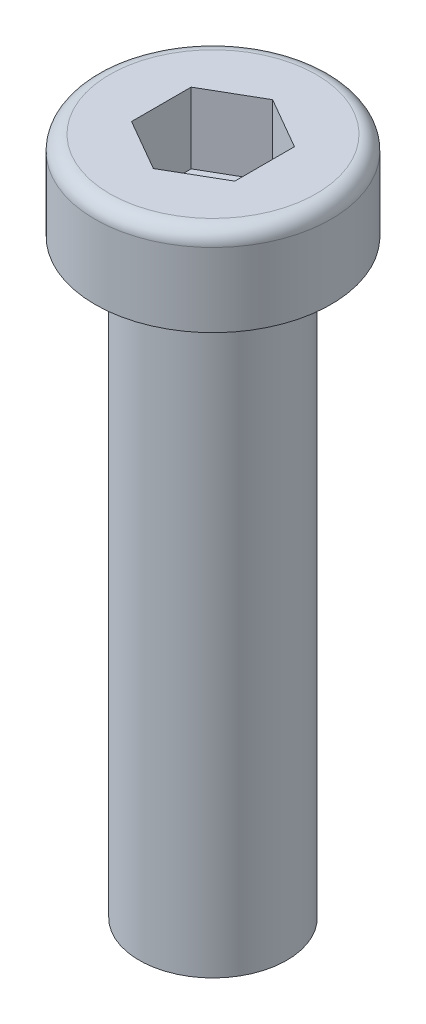
ISO-10303-21;
HEADER;
FILE_DESCRIPTION(('STEP AP214'),'2;1');
FILE_NAME('part.step','',(''),(''),'','','');
FILE_SCHEMA(('AUTOMOTIVE_DESIGN { 1 0 10303 214 1 1 1 1 }'));
ENDSEC;
DATA;
#1=APPLICATION_CONTEXT('core data for automotive mechanical design processes');
#2=APPLICATION_PROTOCOL_DEFINITION('international standard','automotive_design',2000,#1);
#3=PRODUCT_CONTEXT('',#1,'mechanical');
#4=PRODUCT('Part','Part','',(#3));
#5=PRODUCT_RELATED_PRODUCT_CATEGORY('part','',(#4));
#6=PRODUCT_DEFINITION_FORMATION('','',#4);
#7=PRODUCT_DEFINITION_CONTEXT('part definition',#1,'design');
#8=PRODUCT_DEFINITION('design','',#6,#7);
#9=PRODUCT_DEFINITION_SHAPE('','',#8);
#10=(LENGTH_UNIT() NAMED_UNIT(*) SI_UNIT(.MILLI.,.METRE.));
#11=(NAMED_UNIT(*) PLANE_ANGLE_UNIT() SI_UNIT($,.RADIAN.));
#12=(NAMED_UNIT(*) SI_UNIT($,.STERADIAN.) SOLID_ANGLE_UNIT());
#13=UNCERTAINTY_MEASURE_WITH_UNIT(LENGTH_MEASURE(1.E-05),#10,'distance_accuracy_value','');
#14=(GEOMETRIC_REPRESENTATION_CONTEXT(3) GLOBAL_UNCERTAINTY_ASSIGNED_CONTEXT((#13)) GLOBAL_UNIT_ASSIGNED_CONTEXT((#10,
#11,#12)) REPRESENTATION_CONTEXT('',''));
#15=CARTESIAN_POINT('',(0.,0.,0.));
#16=DIRECTION('',(0.,0.,1.));
#17=DIRECTION('',(1.,0.,0.));
#18=AXIS2_PLACEMENT_3D('',#15,#16,#17);
#19=CARTESIAN_POINT('',(0.,46.,0.));
#20=DIRECTION('',(0.,-1.,0.));
#21=DIRECTION('',(0.,0.,-1.));
#22=AXIS2_PLACEMENT_3D('',#19,#20,#21);
#23=PLANE('',#22);
#24=DIRECTION('',(-0.866025403784439,0.,0.5));
#25=VECTOR('',#24,1.);
#26=CARTESIAN_POINT('',(0.,46.,-4.04145188432738));
#27=LINE('',#26,#25);
#28=CARTESIAN_POINT('',(0.,46.,-4.04145188432738));
#29=VERTEX_POINT('',#28);
#30=CARTESIAN_POINT('',(-3.5,46.,-2.02072594216369));
#31=VERTEX_POINT('',#30);
#32=EDGE_CURVE('E125',#29,#31,#27,.T.);
#33=ORIENTED_EDGE('',*,*,#32,.F.);
#34=DIRECTION('',(-0.866025403784439,0.,-0.5));
#35=VECTOR('',#34,1.);
#36=CARTESIAN_POINT('',(3.5,46.,-2.02072594216369));
#37=LINE('',#36,#35);
#38=CARTESIAN_POINT('',(3.5,46.,-2.02072594216369));
#39=VERTEX_POINT('',#38);
#40=EDGE_CURVE('E51',#39,#29,#37,.T.);
#41=ORIENTED_EDGE('',*,*,#40,.F.);
#42=DIRECTION('',(0.,0.,-1.));
#43=VECTOR('',#42,1.);
#44=CARTESIAN_POINT('',(3.50000000000001,46.,2.02072594216369));
#45=LINE('',#44,#43);
#46=CARTESIAN_POINT('',(3.50000000000001,46.,2.02072594216369));
#47=VERTEX_POINT('',#46);
#48=EDGE_CURVE('E134',#47,#39,#45,.T.);
#49=ORIENTED_EDGE('',*,*,#48,.F.);
#50=DIRECTION('',(0.866025403784439,0.,-0.5));
#51=VECTOR('',#50,1.);
#52=CARTESIAN_POINT('',(0.,46.,4.04145188432738));
#53=LINE('',#52,#51);
#54=CARTESIAN_POINT('',(0.,46.,4.04145188432738));
#55=VERTEX_POINT('',#54);
#56=EDGE_CURVE('E132',#55,#47,#53,.T.);
#57=ORIENTED_EDGE('',*,*,#56,.F.);
#58=DIRECTION('',(0.866025403784439,0.,0.5));
#59=VECTOR('',#58,1.);
#60=CARTESIAN_POINT('',(-3.5,46.,2.02072594216369));
#61=LINE('',#60,#59);
#62=CARTESIAN_POINT('',(-3.5,46.,2.02072594216369));
#63=VERTEX_POINT('',#62);
#64=EDGE_CURVE('E99',#63,#55,#61,.T.);
#65=ORIENTED_EDGE('',*,*,#64,.F.);
#66=DIRECTION('',(0.,0.,1.));
#67=VECTOR('',#66,1.);
#68=CARTESIAN_POINT('',(-3.5,46.,-2.02072594216369));
#69=LINE('',#68,#67);
#70=EDGE_CURVE('E128',#31,#63,#69,.T.);
#71=ORIENTED_EDGE('',*,*,#70,.F.);
#72=EDGE_LOOP('',(#33,#41,#49,#57,#65,#71));
#73=FACE_BOUND('',#72,.T.);
#74=CARTESIAN_POINT('',(0.,46.,0.));
#75=DIRECTION('',(0.,-1.,0.));
#76=DIRECTION('',(0.,0.,-1.));
#77=AXIS2_PLACEMENT_3D('',#74,#75,#76);
#78=CIRCLE('',#77,7.);
#79=CARTESIAN_POINT('',(0.,46.,-7.));
#80=VERTEX_POINT('',#79);
#81=EDGE_CURVE('E11',#80,#80,#78,.T.);
#82=ORIENTED_EDGE('',*,*,#81,.F.);
#83=EDGE_LOOP('',(#82));
#84=FACE_BOUND('',#83,.T.);
#85=ADVANCED_FACE('F37',(#73,#84),#23,.F.);
#86=CARTESIAN_POINT('',(0.,45.,0.));
#87=DIRECTION('',(0.,-1.,0.));
#88=DIRECTION('',(0.,0.,-1.));
#89=AXIS2_PLACEMENT_3D('',#86,#87,#88);
#90=TOROIDAL_SURFACE('',#89,7.,1.);
#91=CARTESIAN_POINT('',(0.,45.,0.));
#92=DIRECTION('',(0.,-1.,0.));
#93=DIRECTION('',(0.,0.,-1.));
#94=AXIS2_PLACEMENT_3D('',#91,#92,#93);
#95=CIRCLE('',#94,8.);
#96=CARTESIAN_POINT('',(0.,45.,-8.));
#97=VERTEX_POINT('',#96);
#98=EDGE_CURVE('E44',#97,#97,#95,.T.);
#99=ORIENTED_EDGE('',*,*,#98,.F.);
#100=EDGE_LOOP('',(#99));
#101=FACE_BOUND('',#100,.T.);
#102=ORIENTED_EDGE('',*,*,#81,.T.);
#103=EDGE_LOOP('',(#102));
#104=FACE_BOUND('',#103,.T.);
#105=ADVANCED_FACE('F156',(#101,#104),#90,.T.);
#106=CARTESIAN_POINT('',(0.,0.,0.));
#107=DIRECTION('',(0.,-1.,0.));
#108=DIRECTION('',(0.,0.,-1.));
#109=AXIS2_PLACEMENT_3D('',#106,#107,#108);
#110=CYLINDRICAL_SURFACE('',#109,8.);
#111=CARTESIAN_POINT('',(0.,40.,0.));
#112=DIRECTION('',(0.,-1.,0.));
#113=DIRECTION('',(0.,0.,-1.));
#114=AXIS2_PLACEMENT_3D('',#111,#112,#113);
#115=CIRCLE('',#114,8.);
#116=CARTESIAN_POINT('',(0.,40.,-8.));
#117=VERTEX_POINT('',#116);
#118=EDGE_CURVE('E149',#117,#117,#115,.T.);
#119=ORIENTED_EDGE('',*,*,#118,.F.);
#120=EDGE_LOOP('',(#119));
#121=FACE_BOUND('',#120,.T.);
#122=ORIENTED_EDGE('',*,*,#98,.T.);
#123=EDGE_LOOP('',(#122));
#124=FACE_BOUND('',#123,.T.);
#125=ADVANCED_FACE('F154',(#121,#124),#110,.T.);
#126=CARTESIAN_POINT('',(-8.,40.,0.));
#127=DIRECTION('',(0.,1.,0.));
#128=DIRECTION('',(0.,0.,1.));
#129=AXIS2_PLACEMENT_3D('',#126,#127,#128);
#130=PLANE('',#129);
#131=CARTESIAN_POINT('',(0.,40.,0.));
#132=DIRECTION('',(0.,-1.,0.));
#133=DIRECTION('',(0.,0.,-1.));
#134=AXIS2_PLACEMENT_3D('',#131,#132,#133);
#135=CIRCLE('',#134,5.);
#136=CARTESIAN_POINT('',(0.,40.,-5.));
#137=VERTEX_POINT('',#136);
#138=EDGE_CURVE('E146',#137,#137,#135,.T.);
#139=ORIENTED_EDGE('',*,*,#138,.F.);
#140=EDGE_LOOP('',(#139));
#141=FACE_BOUND('',#140,.T.);
#142=ORIENTED_EDGE('',*,*,#118,.T.);
#143=EDGE_LOOP('',(#142));
#144=FACE_BOUND('',#143,.T.);
#145=ADVANCED_FACE('F189',(#141,#144),#130,.F.);
#146=CARTESIAN_POINT('',(0.,0.,0.));
#147=DIRECTION('',(0.,-1.,0.));
#148=DIRECTION('',(0.,0.,-1.));
#149=AXIS2_PLACEMENT_3D('',#146,#147,#148);
#150=CYLINDRICAL_SURFACE('',#149,5.);
#151=CARTESIAN_POINT('',(0.,0.,0.));
#152=DIRECTION('',(0.,-1.,0.));
#153=DIRECTION('',(0.,0.,-1.));
#154=AXIS2_PLACEMENT_3D('',#151,#152,#153);
#155=CIRCLE('',#154,5.);
#156=CARTESIAN_POINT('',(0.,0.,-5.));
#157=VERTEX_POINT('',#156);
#158=EDGE_CURVE('E138',#157,#157,#155,.T.);
#159=ORIENTED_EDGE('',*,*,#158,.F.);
#160=EDGE_LOOP('',(#159));
#161=FACE_BOUND('',#160,.T.);
#162=ORIENTED_EDGE('',*,*,#138,.T.);
#163=EDGE_LOOP('',(#162));
#164=FACE_BOUND('',#163,.T.);
#165=ADVANCED_FACE('F181',(#161,#164),#150,.T.);
#166=CARTESIAN_POINT('',(-5.,0.,0.));
#167=DIRECTION('',(0.,1.,0.));
#168=DIRECTION('',(0.,0.,1.));
#169=AXIS2_PLACEMENT_3D('',#166,#167,#168);
#170=PLANE('',#169);
#171=ORIENTED_EDGE('',*,*,#158,.T.);
#172=EDGE_LOOP('',(#171));
#173=FACE_BOUND('',#172,.T.);
#174=ADVANCED_FACE('F175',(#173),#170,.F.);
#175=CARTESIAN_POINT('',(3.5,41.2,-2.02072594216369));
#176=DIRECTION('',(0.5,0.,-0.866025403784439));
#177=DIRECTION('',(-0.866025403784439,0.,-0.5));
#178=AXIS2_PLACEMENT_3D('',#175,#176,#177);
#179=PLANE('',#178);
#180=ORIENTED_EDGE('',*,*,#40,.T.);
#181=DIRECTION('',(0.,1.,0.));
#182=VECTOR('',#181,1.);
#183=CARTESIAN_POINT('',(0.,41.2,-4.04145188432738));
#184=LINE('',#183,#182);
#185=CARTESIAN_POINT('',(0.,41.2,-4.04145188432738));
#186=VERTEX_POINT('',#185);
#187=EDGE_CURVE('E81',#186,#29,#184,.T.);
#188=ORIENTED_EDGE('',*,*,#187,.F.);
#189=DIRECTION('',(-0.866025403784439,0.,-0.5));
#190=VECTOR('',#189,1.);
#191=CARTESIAN_POINT('',(3.5,41.2,-2.02072594216369));
#192=LINE('',#191,#190);
#193=CARTESIAN_POINT('',(3.5,41.2,-2.02072594216369));
#194=VERTEX_POINT('',#193);
#195=EDGE_CURVE('E136',#194,#186,#192,.T.);
#196=ORIENTED_EDGE('',*,*,#195,.F.);
#197=DIRECTION('',(0.,1.,0.));
#198=VECTOR('',#197,1.);
#199=CARTESIAN_POINT('',(3.5,41.2,-2.02072594216369));
#200=LINE('',#199,#198);
#201=EDGE_CURVE('E59',#194,#39,#200,.T.);
#202=ORIENTED_EDGE('',*,*,#201,.T.);
#203=EDGE_LOOP('',(#180,#188,#196,#202));
#204=FACE_BOUND('',#203,.T.);
#205=ADVANCED_FACE('F173',(#204),#179,.F.);
#206=CARTESIAN_POINT('',(3.50000000000001,41.2,2.02072594216369));
#207=DIRECTION('',(1.,0.,0.));
#208=DIRECTION('',(0.,0.,-1.));
#209=AXIS2_PLACEMENT_3D('',#206,#207,#208);
#210=PLANE('',#209);
#211=ORIENTED_EDGE('',*,*,#48,.T.);
#212=ORIENTED_EDGE('',*,*,#201,.F.);
#213=DIRECTION('',(0.,0.,-1.));
#214=VECTOR('',#213,1.);
#215=CARTESIAN_POINT('',(3.50000000000001,41.2,2.02072594216369));
#216=LINE('',#215,#214);
#217=CARTESIAN_POINT('',(3.50000000000001,41.2,2.02072594216369));
#218=VERTEX_POINT('',#217);
#219=EDGE_CURVE('E111',#218,#194,#216,.T.);
#220=ORIENTED_EDGE('',*,*,#219,.F.);
#221=DIRECTION('',(0.,1.,0.));
#222=VECTOR('',#221,1.);
#223=CARTESIAN_POINT('',(3.50000000000001,41.2,2.02072594216369));
#224=LINE('',#223,#222);
#225=EDGE_CURVE('E103',#218,#47,#224,.T.);
#226=ORIENTED_EDGE('',*,*,#225,.T.);
#227=EDGE_LOOP('',(#211,#212,#220,#226));
#228=FACE_BOUND('',#227,.T.);
#229=ADVANCED_FACE('F174',(#228),#210,.F.);
#230=CARTESIAN_POINT('',(0.,41.2,4.04145188432738));
#231=DIRECTION('',(0.5,0.,0.866025403784439));
#232=DIRECTION('',(0.866025403784439,0.,-0.5));
#233=AXIS2_PLACEMENT_3D('',#230,#231,#232);
#234=PLANE('',#233);
#235=ORIENTED_EDGE('',*,*,#56,.T.);
#236=ORIENTED_EDGE('',*,*,#225,.F.);
#237=DIRECTION('',(0.866025403784439,0.,-0.5));
#238=VECTOR('',#237,1.);
#239=CARTESIAN_POINT('',(0.,41.2,4.04145188432738));
#240=LINE('',#239,#238);
#241=CARTESIAN_POINT('',(0.,41.2,4.04145188432738));
#242=VERTEX_POINT('',#241);
#243=EDGE_CURVE('E107',#242,#218,#240,.T.);
#244=ORIENTED_EDGE('',*,*,#243,.F.);
#245=DIRECTION('',(0.,1.,0.));
#246=VECTOR('',#245,1.);
#247=CARTESIAN_POINT('',(0.,41.2,4.04145188432738));
#248=LINE('',#247,#246);
#249=EDGE_CURVE('E92',#242,#55,#248,.T.);
#250=ORIENTED_EDGE('',*,*,#249,.T.);
#251=EDGE_LOOP('',(#235,#236,#244,#250));
#252=FACE_BOUND('',#251,.T.);
#253=ADVANCED_FACE('F108',(#252),#234,.F.);
#254=CARTESIAN_POINT('',(-3.5,41.2,2.02072594216369));
#255=DIRECTION('',(-0.5,0.,0.866025403784439));
#256=DIRECTION('',(0.866025403784439,0.,0.5));
#257=AXIS2_PLACEMENT_3D('',#254,#255,#256);
#258=PLANE('',#257);
#259=ORIENTED_EDGE('',*,*,#64,.T.);
#260=ORIENTED_EDGE('',*,*,#249,.F.);
#261=DIRECTION('',(0.866025403784439,0.,0.5));
#262=VECTOR('',#261,1.);
#263=CARTESIAN_POINT('',(-3.5,41.2,2.02072594216369));
#264=LINE('',#263,#262);
#265=CARTESIAN_POINT('',(-3.5,41.2,2.02072594216369));
#266=VERTEX_POINT('',#265);
#267=EDGE_CURVE('E96',#266,#242,#264,.T.);
#268=ORIENTED_EDGE('',*,*,#267,.F.);
#269=DIRECTION('',(0.,1.,0.));
#270=VECTOR('',#269,1.);
#271=CARTESIAN_POINT('',(-3.5,41.2,2.02072594216369));
#272=LINE('',#271,#270);
#273=EDGE_CURVE('E104',#266,#63,#272,.T.);
#274=ORIENTED_EDGE('',*,*,#273,.T.);
#275=EDGE_LOOP('',(#259,#260,#268,#274));
#276=FACE_BOUND('',#275,.T.);
#277=ADVANCED_FACE('F94',(#276),#258,.F.);
#278=CARTESIAN_POINT('',(-3.5,41.2,-2.02072594216369));
#279=DIRECTION('',(-1.,0.,0.));
#280=DIRECTION('',(0.,0.,1.));
#281=AXIS2_PLACEMENT_3D('',#278,#279,#280);
#282=PLANE('',#281);
#283=ORIENTED_EDGE('',*,*,#70,.T.);
#284=ORIENTED_EDGE('',*,*,#273,.F.);
#285=DIRECTION('',(0.,0.,1.));
#286=VECTOR('',#285,1.);
#287=CARTESIAN_POINT('',(-3.5,41.2,-2.02072594216369));
#288=LINE('',#287,#286);
#289=CARTESIAN_POINT('',(-3.5,41.2,-2.02072594216369));
#290=VERTEX_POINT('',#289);
#291=EDGE_CURVE('E117',#290,#266,#288,.T.);
#292=ORIENTED_EDGE('',*,*,#291,.F.);
#293=DIRECTION('',(0.,1.,0.));
#294=VECTOR('',#293,1.);
#295=CARTESIAN_POINT('',(-3.5,41.2,-2.02072594216369));
#296=LINE('',#295,#294);
#297=EDGE_CURVE('E141',#290,#31,#296,.T.);
#298=ORIENTED_EDGE('',*,*,#297,.T.);
#299=EDGE_LOOP('',(#283,#284,#292,#298));
#300=FACE_BOUND('',#299,.T.);
#301=ADVANCED_FACE('F233',(#300),#282,.F.);
#302=CARTESIAN_POINT('',(0.,41.2,-4.04145188432738));
#303=DIRECTION('',(-0.5,0.,-0.866025403784439));
#304=DIRECTION('',(-0.866025403784439,0.,0.5));
#305=AXIS2_PLACEMENT_3D('',#302,#303,#304);
#306=PLANE('',#305);
#307=ORIENTED_EDGE('',*,*,#32,.T.);
#308=ORIENTED_EDGE('',*,*,#297,.F.);
#309=DIRECTION('',(-0.866025403784439,0.,0.5));
#310=VECTOR('',#309,1.);
#311=CARTESIAN_POINT('',(0.,41.2,-4.04145188432738));
#312=LINE('',#311,#310);
#313=EDGE_CURVE('E119',#186,#290,#312,.T.);
#314=ORIENTED_EDGE('',*,*,#313,.F.);
#315=ORIENTED_EDGE('',*,*,#187,.T.);
#316=EDGE_LOOP('',(#307,#308,#314,#315));
#317=FACE_BOUND('',#316,.T.);
#318=ADVANCED_FACE('F171',(#317),#306,.F.);
#319=CARTESIAN_POINT('',(0.,41.2,0.));
#320=DIRECTION('',(0.,1.,0.));
#321=DIRECTION('',(0.,0.,1.));
#322=AXIS2_PLACEMENT_3D('',#319,#320,#321);
#323=PLANE('',#322);
#324=ORIENTED_EDGE('',*,*,#195,.T.);
#325=ORIENTED_EDGE('',*,*,#313,.T.);
#326=ORIENTED_EDGE('',*,*,#291,.T.);
#327=ORIENTED_EDGE('',*,*,#267,.T.);
#328=ORIENTED_EDGE('',*,*,#243,.T.);
#329=ORIENTED_EDGE('',*,*,#219,.T.);
#330=EDGE_LOOP('',(#324,#325,#326,#327,#328,#329));
#331=FACE_BOUND('',#330,.T.);
#332=ADVANCED_FACE('F114',(#331),#323,.T.);
#333=CLOSED_SHELL('',(#85,#105,#125,#145,#165,#174,#205,#229,#253,#277,#301,#318,#332));
#334=MANIFOLD_SOLID_BREP('B2',#333);
#335=ADVANCED_BREP_SHAPE_REPRESENTATION('',(#18,#334),#14);
#336=SHAPE_DEFINITION_REPRESENTATION(#9,#335);
ENDSEC;
END-ISO-10303-21;
